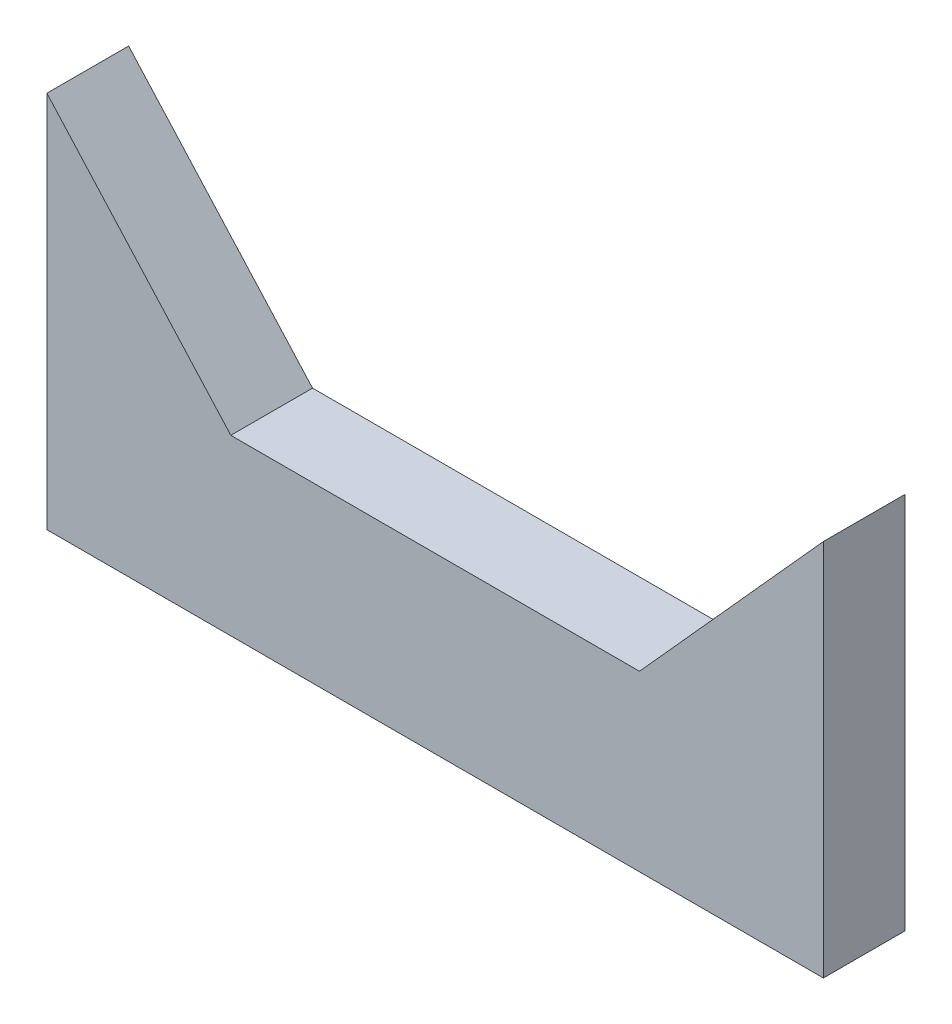
ISO-10303-21;
HEADER;
FILE_DESCRIPTION(('STEP AP214'),'2;1');
FILE_NAME('part.step','',(''),(''),'','','');
FILE_SCHEMA(('AUTOMOTIVE_DESIGN { 1 0 10303 214 1 1 1 1 }'));
ENDSEC;
DATA;
#1=APPLICATION_CONTEXT('core data for automotive mechanical design processes');
#2=APPLICATION_PROTOCOL_DEFINITION('international standard','automotive_design',2000,#1);
#3=PRODUCT_CONTEXT('',#1,'mechanical');
#4=PRODUCT('Part','Part','',(#3));
#5=PRODUCT_RELATED_PRODUCT_CATEGORY('part','',(#4));
#6=PRODUCT_DEFINITION_FORMATION('','',#4);
#7=PRODUCT_DEFINITION_CONTEXT('part definition',#1,'design');
#8=PRODUCT_DEFINITION('design','',#6,#7);
#9=PRODUCT_DEFINITION_SHAPE('','',#8);
#10=(LENGTH_UNIT() NAMED_UNIT(*) SI_UNIT(.MILLI.,.METRE.));
#11=(NAMED_UNIT(*) PLANE_ANGLE_UNIT() SI_UNIT($,.RADIAN.));
#12=(NAMED_UNIT(*) SI_UNIT($,.STERADIAN.) SOLID_ANGLE_UNIT());
#13=UNCERTAINTY_MEASURE_WITH_UNIT(LENGTH_MEASURE(1.E-05),#10,'distance_accuracy_value','');
#14=(GEOMETRIC_REPRESENTATION_CONTEXT(3) GLOBAL_UNCERTAINTY_ASSIGNED_CONTEXT((#13)) GLOBAL_UNIT_ASSIGNED_CONTEXT((#10,
#11,#12)) REPRESENTATION_CONTEXT('',''));
#15=CARTESIAN_POINT('',(0.,0.,0.));
#16=DIRECTION('',(0.,0.,1.));
#17=DIRECTION('',(1.,0.,0.));
#18=AXIS2_PLACEMENT_3D('',#15,#16,#17);
#19=CARTESIAN_POINT('',(19.,8.30430229407662,4.));
#20=DIRECTION('',(0.743294146247165,-0.668964731622451,0.));
#21=DIRECTION('',(0.668964731622451,0.743294146247165,0.));
#22=AXIS2_PLACEMENT_3D('',#19,#20,#21);
#23=PLANE('',#22);
#24=DIRECTION('',(-0.668964731622451,-0.743294146247165,0.));
#25=VECTOR('',#24,1.);
#26=CARTESIAN_POINT('',(19.,8.30430229407662,0.));
#27=LINE('',#26,#25);
#28=CARTESIAN_POINT('',(19.,8.30430229407662,0.));
#29=VERTEX_POINT('',#28);
#30=CARTESIAN_POINT('',(10.,-1.69569770592337,0.));
#31=VERTEX_POINT('',#30);
#32=EDGE_CURVE('E128',#29,#31,#27,.T.);
#33=ORIENTED_EDGE('',*,*,#32,.T.);
#34=DIRECTION('',(0.,0.,-1.));
#35=VECTOR('',#34,1.);
#36=CARTESIAN_POINT('',(10.,-1.69569770592337,4.));
#37=LINE('',#36,#35);
#38=CARTESIAN_POINT('',(10.,-1.69569770592337,4.));
#39=VERTEX_POINT('',#38);
#40=EDGE_CURVE('E11',#39,#31,#37,.T.);
#41=ORIENTED_EDGE('',*,*,#40,.F.);
#42=DIRECTION('',(-0.668964731622451,-0.743294146247165,0.));
#43=VECTOR('',#42,1.);
#44=CARTESIAN_POINT('',(19.,8.30430229407662,4.));
#45=LINE('',#44,#43);
#46=CARTESIAN_POINT('',(19.,8.30430229407662,4.));
#47=VERTEX_POINT('',#46);
#48=EDGE_CURVE('E144',#47,#39,#45,.T.);
#49=ORIENTED_EDGE('',*,*,#48,.F.);
#50=DIRECTION('',(0.,0.,-1.));
#51=VECTOR('',#50,1.);
#52=CARTESIAN_POINT('',(19.,8.30430229407662,4.));
#53=LINE('',#52,#51);
#54=EDGE_CURVE('E124',#47,#29,#53,.T.);
#55=ORIENTED_EDGE('',*,*,#54,.T.);
#56=EDGE_LOOP('',(#33,#41,#49,#55));
#57=FACE_BOUND('',#56,.T.);
#58=ADVANCED_FACE('F39',(#57),#23,.F.);
#59=CARTESIAN_POINT('',(10.,-1.69569770592337,4.));
#60=DIRECTION('',(0.,-1.,0.));
#61=DIRECTION('',(0.,0.,-1.));
#62=AXIS2_PLACEMENT_3D('',#59,#60,#61);
#63=PLANE('',#62);
#64=DIRECTION('',(-1.,0.,0.));
#65=VECTOR('',#64,1.);
#66=CARTESIAN_POINT('',(10.,-1.69569770592337,0.));
#67=LINE('',#66,#65);
#68=CARTESIAN_POINT('',(-10.,-1.69569770592337,0.));
#69=VERTEX_POINT('',#68);
#70=EDGE_CURVE('E132',#31,#69,#67,.T.);
#71=ORIENTED_EDGE('',*,*,#70,.T.);
#72=DIRECTION('',(0.,0.,-1.));
#73=VECTOR('',#72,1.);
#74=CARTESIAN_POINT('',(-10.,-1.69569770592337,4.));
#75=LINE('',#74,#73);
#76=CARTESIAN_POINT('',(-10.,-1.69569770592337,4.));
#77=VERTEX_POINT('',#76);
#78=EDGE_CURVE('E48',#77,#69,#75,.T.);
#79=ORIENTED_EDGE('',*,*,#78,.F.);
#80=DIRECTION('',(-1.,0.,0.));
#81=VECTOR('',#80,1.);
#82=CARTESIAN_POINT('',(10.,-1.69569770592337,4.));
#83=LINE('',#82,#81);
#84=EDGE_CURVE('E93',#39,#77,#83,.T.);
#85=ORIENTED_EDGE('',*,*,#84,.F.);
#86=ORIENTED_EDGE('',*,*,#40,.T.);
#87=EDGE_LOOP('',(#71,#79,#85,#86));
#88=FACE_BOUND('',#87,.T.);
#89=ADVANCED_FACE('F172',(#88),#63,.F.);
#90=CARTESIAN_POINT('',(-19.,8.30430229407662,4.));
#91=DIRECTION('',(-0.743294146247165,-0.668964731622451,0.));
#92=DIRECTION('',(0.668964731622451,-0.743294146247165,0.));
#93=AXIS2_PLACEMENT_3D('',#90,#91,#92);
#94=PLANE('',#93);
#95=DIRECTION('',(-0.668964731622451,0.743294146247165,0.));
#96=VECTOR('',#95,1.);
#97=CARTESIAN_POINT('',(-19.,8.30430229407662,0.));
#98=LINE('',#97,#96);
#99=CARTESIAN_POINT('',(-19.,8.30430229407662,0.));
#100=VERTEX_POINT('',#99);
#101=EDGE_CURVE('E135',#69,#100,#98,.T.);
#102=ORIENTED_EDGE('',*,*,#101,.T.);
#103=DIRECTION('',(0.,0.,-1.));
#104=VECTOR('',#103,1.);
#105=CARTESIAN_POINT('',(-19.,8.30430229407662,4.));
#106=LINE('',#105,#104);
#107=CARTESIAN_POINT('',(-19.,8.30430229407662,4.));
#108=VERTEX_POINT('',#107);
#109=EDGE_CURVE('E117',#108,#100,#106,.T.);
#110=ORIENTED_EDGE('',*,*,#109,.F.);
#111=DIRECTION('',(-0.668964731622451,0.743294146247165,0.));
#112=VECTOR('',#111,1.);
#113=CARTESIAN_POINT('',(-19.,8.30430229407662,4.));
#114=LINE('',#113,#112);
#115=EDGE_CURVE('E106',#77,#108,#114,.T.);
#116=ORIENTED_EDGE('',*,*,#115,.F.);
#117=ORIENTED_EDGE('',*,*,#78,.T.);
#118=EDGE_LOOP('',(#102,#110,#116,#117));
#119=FACE_BOUND('',#118,.T.);
#120=ADVANCED_FACE('F154',(#119),#94,.F.);
#121=CARTESIAN_POINT('',(-19.,8.30430229407662,4.));
#122=DIRECTION('',(1.,0.,0.));
#123=DIRECTION('',(0.,1.,0.));
#124=AXIS2_PLACEMENT_3D('',#121,#122,#123);
#125=PLANE('',#124);
#126=DIRECTION('',(0.,-1.,0.));
#127=VECTOR('',#126,1.);
#128=CARTESIAN_POINT('',(-19.,8.30430229407662,0.));
#129=LINE('',#128,#127);
#130=CARTESIAN_POINT('',(-19.,-10.1956977059234,0.));
#131=VERTEX_POINT('',#130);
#132=EDGE_CURVE('E115',#100,#131,#129,.T.);
#133=ORIENTED_EDGE('',*,*,#132,.T.);
#134=DIRECTION('',(0.,0.,-1.));
#135=VECTOR('',#134,1.);
#136=CARTESIAN_POINT('',(-19.,-10.1956977059234,4.));
#137=LINE('',#136,#135);
#138=CARTESIAN_POINT('',(-19.,-10.1956977059234,4.));
#139=VERTEX_POINT('',#138);
#140=EDGE_CURVE('E112',#139,#131,#137,.T.);
#141=ORIENTED_EDGE('',*,*,#140,.F.);
#142=DIRECTION('',(0.,-1.,0.));
#143=VECTOR('',#142,1.);
#144=CARTESIAN_POINT('',(-19.,8.30430229407662,4.));
#145=LINE('',#144,#143);
#146=EDGE_CURVE('E100',#108,#139,#145,.T.);
#147=ORIENTED_EDGE('',*,*,#146,.F.);
#148=ORIENTED_EDGE('',*,*,#109,.T.);
#149=EDGE_LOOP('',(#133,#141,#147,#148));
#150=FACE_BOUND('',#149,.T.);
#151=ADVANCED_FACE('F113',(#150),#125,.F.);
#152=CARTESIAN_POINT('',(19.,-10.1956977059234,4.));
#153=DIRECTION('',(0.,1.,0.));
#154=DIRECTION('',(0.,0.,1.));
#155=AXIS2_PLACEMENT_3D('',#152,#153,#154);
#156=PLANE('',#155);
#157=DIRECTION('',(1.,0.,0.));
#158=VECTOR('',#157,1.);
#159=CARTESIAN_POINT('',(19.,-10.1956977059234,0.));
#160=LINE('',#159,#158);
#161=CARTESIAN_POINT('',(19.,-10.1956977059234,0.));
#162=VERTEX_POINT('',#161);
#163=EDGE_CURVE('E79',#131,#162,#160,.T.);
#164=ORIENTED_EDGE('',*,*,#163,.T.);
#165=DIRECTION('',(0.,0.,-1.));
#166=VECTOR('',#165,1.);
#167=CARTESIAN_POINT('',(19.,-10.1956977059234,4.));
#168=LINE('',#167,#166);
#169=CARTESIAN_POINT('',(19.,-10.1956977059234,4.));
#170=VERTEX_POINT('',#169);
#171=EDGE_CURVE('E118',#170,#162,#168,.T.);
#172=ORIENTED_EDGE('',*,*,#171,.F.);
#173=DIRECTION('',(1.,0.,0.));
#174=VECTOR('',#173,1.);
#175=CARTESIAN_POINT('',(19.,-10.1956977059234,4.));
#176=LINE('',#175,#174);
#177=EDGE_CURVE('E104',#139,#170,#176,.T.);
#178=ORIENTED_EDGE('',*,*,#177,.F.);
#179=ORIENTED_EDGE('',*,*,#140,.T.);
#180=EDGE_LOOP('',(#164,#172,#178,#179));
#181=FACE_BOUND('',#180,.T.);
#182=ADVANCED_FACE('F120',(#181),#156,.F.);
#183=CARTESIAN_POINT('',(19.,8.30430229407662,4.));
#184=DIRECTION('',(-1.,0.,0.));
#185=DIRECTION('',(0.,-1.,0.));
#186=AXIS2_PLACEMENT_3D('',#183,#184,#185);
#187=PLANE('',#186);
#188=DIRECTION('',(0.,1.,0.));
#189=VECTOR('',#188,1.);
#190=CARTESIAN_POINT('',(19.,8.30430229407662,0.));
#191=LINE('',#190,#189);
#192=EDGE_CURVE('E85',#162,#29,#191,.T.);
#193=ORIENTED_EDGE('',*,*,#192,.T.);
#194=ORIENTED_EDGE('',*,*,#54,.F.);
#195=DIRECTION('',(0.,1.,0.));
#196=VECTOR('',#195,1.);
#197=CARTESIAN_POINT('',(19.,8.30430229407662,4.));
#198=LINE('',#197,#196);
#199=EDGE_CURVE('E56',#170,#47,#198,.T.);
#200=ORIENTED_EDGE('',*,*,#199,.F.);
#201=ORIENTED_EDGE('',*,*,#171,.T.);
#202=EDGE_LOOP('',(#193,#194,#200,#201));
#203=FACE_BOUND('',#202,.T.);
#204=ADVANCED_FACE('F161',(#203),#187,.F.);
#205=CARTESIAN_POINT('',(0.,0.,4.));
#206=DIRECTION('',(0.,0.,1.));
#207=DIRECTION('',(1.,0.,0.));
#208=AXIS2_PLACEMENT_3D('',#205,#206,#207);
#209=PLANE('',#208);
#210=ORIENTED_EDGE('',*,*,#48,.T.);
#211=ORIENTED_EDGE('',*,*,#84,.T.);
#212=ORIENTED_EDGE('',*,*,#115,.T.);
#213=ORIENTED_EDGE('',*,*,#146,.T.);
#214=ORIENTED_EDGE('',*,*,#177,.T.);
#215=ORIENTED_EDGE('',*,*,#199,.T.);
#216=EDGE_LOOP('',(#210,#211,#212,#213,#214,#215));
#217=FACE_BOUND('',#216,.T.);
#218=ADVANCED_FACE('F102',(#217),#209,.T.);
#219=CARTESIAN_POINT('',(0.,0.,0.));
#220=DIRECTION('',(0.,0.,1.));
#221=DIRECTION('',(1.,0.,0.));
#222=AXIS2_PLACEMENT_3D('',#219,#220,#221);
#223=PLANE('',#222);
#224=ORIENTED_EDGE('',*,*,#32,.F.);
#225=ORIENTED_EDGE('',*,*,#192,.F.);
#226=ORIENTED_EDGE('',*,*,#163,.F.);
#227=ORIENTED_EDGE('',*,*,#132,.F.);
#228=ORIENTED_EDGE('',*,*,#101,.F.);
#229=ORIENTED_EDGE('',*,*,#70,.F.);
#230=EDGE_LOOP('',(#224,#225,#226,#227,#228,#229));
#231=FACE_BOUND('',#230,.T.);
#232=ADVANCED_FACE('F157',(#231),#223,.F.);
#233=CLOSED_SHELL('',(#58,#89,#120,#151,#182,#204,#218,#232));
#234=MANIFOLD_SOLID_BREP('B2',#233);
#235=ADVANCED_BREP_SHAPE_REPRESENTATION('',(#18,#234),#14);
#236=SHAPE_DEFINITION_REPRESENTATION(#9,#235);
ENDSEC;
END-ISO-10303-21;
